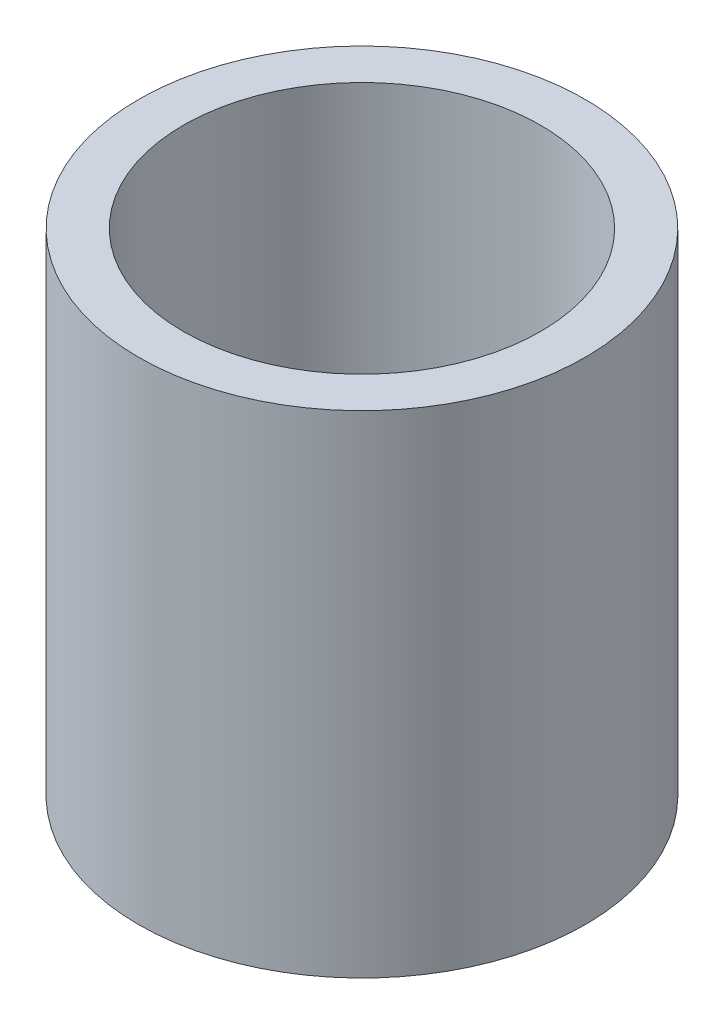
ISO-10303-21;
HEADER;
FILE_DESCRIPTION(('STEP AP214'),'2;1');
FILE_NAME('part.step','',(''),(''),'','','');
FILE_SCHEMA(('AUTOMOTIVE_DESIGN { 1 0 10303 214 1 1 1 1 }'));
ENDSEC;
DATA;
#1=APPLICATION_CONTEXT('core data for automotive mechanical design processes');
#2=APPLICATION_PROTOCOL_DEFINITION('international standard','automotive_design',2000,#1);
#3=PRODUCT_CONTEXT('',#1,'mechanical');
#4=PRODUCT('Part','Part','',(#3));
#5=PRODUCT_RELATED_PRODUCT_CATEGORY('part','',(#4));
#6=PRODUCT_DEFINITION_FORMATION('','',#4);
#7=PRODUCT_DEFINITION_CONTEXT('part definition',#1,'design');
#8=PRODUCT_DEFINITION('design','',#6,#7);
#9=PRODUCT_DEFINITION_SHAPE('','',#8);
#10=(LENGTH_UNIT() NAMED_UNIT(*) SI_UNIT(.MILLI.,.METRE.));
#11=(NAMED_UNIT(*) PLANE_ANGLE_UNIT() SI_UNIT($,.RADIAN.));
#12=(NAMED_UNIT(*) SI_UNIT($,.STERADIAN.) SOLID_ANGLE_UNIT());
#13=UNCERTAINTY_MEASURE_WITH_UNIT(LENGTH_MEASURE(1.E-05),#10,'distance_accuracy_value','');
#14=(GEOMETRIC_REPRESENTATION_CONTEXT(3) GLOBAL_UNCERTAINTY_ASSIGNED_CONTEXT((#13)) GLOBAL_UNIT_ASSIGNED_CONTEXT((#10,
#11,#12)) REPRESENTATION_CONTEXT('',''));
#15=CARTESIAN_POINT('',(0.,0.,0.));
#16=DIRECTION('',(0.,0.,1.));
#17=DIRECTION('',(1.,0.,0.));
#18=AXIS2_PLACEMENT_3D('',#15,#16,#17);
#19=CARTESIAN_POINT('',(0.,1.375,0.));
#20=DIRECTION('',(0.,1.,0.));
#21=DIRECTION('',(0.,0.,1.));
#22=AXIS2_PLACEMENT_3D('',#19,#20,#21);
#23=PLANE('',#22);
#24=CARTESIAN_POINT('',(0.,1.375,0.));
#25=DIRECTION('',(0.,1.,0.));
#26=DIRECTION('',(0.,0.,1.));
#27=AXIS2_PLACEMENT_3D('',#24,#25,#26);
#28=CIRCLE('',#27,0.625);
#29=CARTESIAN_POINT('',(0.,1.375,0.625));
#30=VERTEX_POINT('',#29);
#31=EDGE_CURVE('E10',#30,#30,#28,.T.);
#32=ORIENTED_EDGE('',*,*,#31,.T.);
#33=EDGE_LOOP('',(#32));
#34=FACE_BOUND('',#33,.T.);
#35=CARTESIAN_POINT('',(0.,1.375,0.));
#36=DIRECTION('',(0.,1.,0.));
#37=DIRECTION('',(0.,0.,1.));
#38=AXIS2_PLACEMENT_3D('',#35,#36,#37);
#39=CIRCLE('',#38,0.5);
#40=CARTESIAN_POINT('',(0.,1.375,0.5));
#41=VERTEX_POINT('',#40);
#42=EDGE_CURVE('E46',#41,#41,#39,.T.);
#43=ORIENTED_EDGE('',*,*,#42,.F.);
#44=EDGE_LOOP('',(#43));
#45=FACE_BOUND('',#44,.T.);
#46=ADVANCED_FACE('F35',(#34,#45),#23,.T.);
#47=CARTESIAN_POINT('',(0.,0.,0.));
#48=DIRECTION('',(0.,1.,0.));
#49=DIRECTION('',(0.,0.,1.));
#50=AXIS2_PLACEMENT_3D('',#47,#48,#49);
#51=PLANE('',#50);
#52=CARTESIAN_POINT('',(0.,0.,0.));
#53=DIRECTION('',(0.,1.,0.));
#54=DIRECTION('',(0.,0.,1.));
#55=AXIS2_PLACEMENT_3D('',#52,#53,#54);
#56=CIRCLE('',#55,0.625);
#57=CARTESIAN_POINT('',(0.,0.,0.625));
#58=VERTEX_POINT('',#57);
#59=EDGE_CURVE('E39',#58,#58,#56,.T.);
#60=ORIENTED_EDGE('',*,*,#59,.F.);
#61=EDGE_LOOP('',(#60));
#62=FACE_BOUND('',#61,.T.);
#63=CARTESIAN_POINT('',(0.,0.,0.));
#64=DIRECTION('',(0.,1.,0.));
#65=DIRECTION('',(0.,0.,1.));
#66=AXIS2_PLACEMENT_3D('',#63,#64,#65);
#67=CIRCLE('',#66,0.5);
#68=CARTESIAN_POINT('',(0.,0.,0.5));
#69=VERTEX_POINT('',#68);
#70=EDGE_CURVE('E48',#69,#69,#67,.T.);
#71=ORIENTED_EDGE('',*,*,#70,.T.);
#72=EDGE_LOOP('',(#71));
#73=FACE_BOUND('',#72,.T.);
#74=ADVANCED_FACE('F58',(#62,#73),#51,.F.);
#75=CARTESIAN_POINT('',(0.,1.375,0.));
#76=DIRECTION('',(0.,-1.,0.));
#77=DIRECTION('',(0.,0.,-1.));
#78=AXIS2_PLACEMENT_3D('',#75,#76,#77);
#79=CYLINDRICAL_SURFACE('',#78,0.625);
#80=ORIENTED_EDGE('',*,*,#31,.F.);
#81=EDGE_LOOP('',(#80));
#82=FACE_BOUND('',#81,.T.);
#83=ORIENTED_EDGE('',*,*,#59,.T.);
#84=EDGE_LOOP('',(#83));
#85=FACE_BOUND('',#84,.T.);
#86=ADVANCED_FACE('F37',(#82,#85),#79,.T.);
#87=CARTESIAN_POINT('',(0.,1.375,0.));
#88=DIRECTION('',(0.,-1.,0.));
#89=DIRECTION('',(0.,0.,-1.));
#90=AXIS2_PLACEMENT_3D('',#87,#88,#89);
#91=CYLINDRICAL_SURFACE('',#90,0.5);
#92=ORIENTED_EDGE('',*,*,#42,.T.);
#93=EDGE_LOOP('',(#92));
#94=FACE_BOUND('',#93,.T.);
#95=ORIENTED_EDGE('',*,*,#70,.F.);
#96=EDGE_LOOP('',(#95));
#97=FACE_BOUND('',#96,.T.);
#98=ADVANCED_FACE('F54',(#94,#97),#91,.F.);
#99=CLOSED_SHELL('',(#46,#74,#86,#98));
#100=MANIFOLD_SOLID_BREP('B2',#99);
#101=ADVANCED_BREP_SHAPE_REPRESENTATION('',(#18,#100),#14);
#102=SHAPE_DEFINITION_REPRESENTATION(#9,#101);
ENDSEC;
END-ISO-10303-21;
